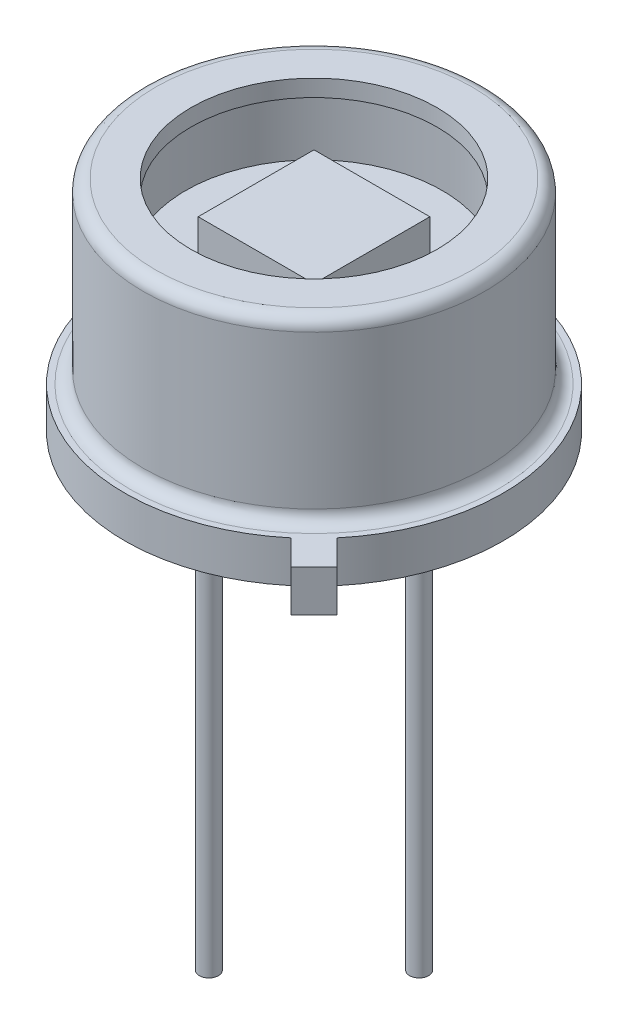
ISO-10303-21;
HEADER;
FILE_DESCRIPTION(('STEP AP214'),'2;1');
FILE_NAME('part.step','',(''),(''),'','','');
FILE_SCHEMA(('AUTOMOTIVE_DESIGN { 1 0 10303 214 1 1 1 1 }'));
ENDSEC;
DATA;
#1=APPLICATION_CONTEXT('core data for automotive mechanical design processes');
#2=APPLICATION_PROTOCOL_DEFINITION('international standard','automotive_design',2000,#1);
#3=PRODUCT_CONTEXT('',#1,'mechanical');
#4=PRODUCT('Part','Part','',(#3));
#5=PRODUCT_RELATED_PRODUCT_CATEGORY('part','',(#4));
#6=PRODUCT_DEFINITION_FORMATION('','',#4);
#7=PRODUCT_DEFINITION_CONTEXT('part definition',#1,'design');
#8=PRODUCT_DEFINITION('design','',#6,#7);
#9=PRODUCT_DEFINITION_SHAPE('','',#8);
#10=(LENGTH_UNIT() NAMED_UNIT(*) SI_UNIT(.MILLI.,.METRE.));
#11=(NAMED_UNIT(*) PLANE_ANGLE_UNIT() SI_UNIT($,.RADIAN.));
#12=(NAMED_UNIT(*) SI_UNIT($,.STERADIAN.) SOLID_ANGLE_UNIT());
#13=UNCERTAINTY_MEASURE_WITH_UNIT(LENGTH_MEASURE(1.E-05),#10,'distance_accuracy_value','');
#14=(GEOMETRIC_REPRESENTATION_CONTEXT(3) GLOBAL_UNCERTAINTY_ASSIGNED_CONTEXT((#13)) GLOBAL_UNIT_ASSIGNED_CONTEXT((#10,
#11,#12)) REPRESENTATION_CONTEXT('',''));
#15=CARTESIAN_POINT('',(0.,0.,0.));
#16=DIRECTION('',(0.,0.,1.));
#17=DIRECTION('',(1.,0.,0.));
#18=AXIS2_PLACEMENT_3D('',#15,#16,#17);
#19=CARTESIAN_POINT('',(0.,-1.,0.));
#20=DIRECTION('',(0.,1.,0.));
#21=DIRECTION('',(0.,0.,1.));
#22=AXIS2_PLACEMENT_3D('',#19,#20,#21);
#23=CYLINDRICAL_SURFACE('',#22,4.572);
#24=CARTESIAN_POINT('',(0.,0.,0.));
#25=DIRECTION('',(0.,1.,0.));
#26=DIRECTION('',(0.,0.,1.));
#27=AXIS2_PLACEMENT_3D('',#24,#25,#26);
#28=CIRCLE('',#27,4.572);
#29=CARTESIAN_POINT('',(3.49927169347665,0.,2.94249581397035));
#30=VERTEX_POINT('',#29);
#31=CARTESIAN_POINT('',(2.94249581397037,0.,3.49927169347664));
#32=VERTEX_POINT('',#31);
#33=EDGE_CURVE('E180',#30,#32,#28,.T.);
#34=ORIENTED_EDGE('',*,*,#33,.F.);
#35=DIRECTION('',(0.,1.,0.));
#36=VECTOR('',#35,1.);
#37=CARTESIAN_POINT('',(3.49927169347665,-0.999999999999999,2.94249581397035));
#38=LINE('',#37,#36);
#39=CARTESIAN_POINT('',(3.49927169347665,-0.999999999999999,2.94249581397035));
#40=VERTEX_POINT('',#39);
#41=EDGE_CURVE('E205',#40,#30,#38,.T.);
#42=ORIENTED_EDGE('',*,*,#41,.F.);
#43=CARTESIAN_POINT('',(0.,-1.,0.));
#44=DIRECTION('',(0.,1.,0.));
#45=DIRECTION('',(0.,0.,1.));
#46=AXIS2_PLACEMENT_3D('',#43,#44,#45);
#47=CIRCLE('',#46,4.572);
#48=CARTESIAN_POINT('',(2.94249581397037,-0.999999999999999,3.49927169347664));
#49=VERTEX_POINT('',#48);
#50=EDGE_CURVE('E181',#40,#49,#47,.T.);
#51=ORIENTED_EDGE('',*,*,#50,.T.);
#52=DIRECTION('',(0.,1.,0.));
#53=VECTOR('',#52,1.);
#54=CARTESIAN_POINT('',(2.94249581397037,-0.999999999999999,3.49927169347664));
#55=LINE('',#54,#53);
#56=EDGE_CURVE('E194',#49,#32,#55,.T.);
#57=ORIENTED_EDGE('',*,*,#56,.T.);
#58=EDGE_LOOP('',(#34,#42,#51,#57));
#59=FACE_BOUND('',#58,.T.);
#60=ADVANCED_FACE('F36',(#59),#23,.T.);
#61=CARTESIAN_POINT('',(4.10992910970935,-0.999999999999999,3.55315323020305));
#62=DIRECTION('',(0.707106781186545,0.,-0.70710678118655));
#63=DIRECTION('',(-0.70710678118655,0.,-0.707106781186545));
#64=AXIS2_PLACEMENT_3D('',#61,#62,#63);
#65=PLANE('',#64);
#66=DIRECTION('',(-0.70710678118655,0.,-0.707106781186545));
#67=VECTOR('',#66,1.);
#68=CARTESIAN_POINT('',(4.10992910970935,0.,3.55315323020305));
#69=LINE('',#68,#67);
#70=CARTESIAN_POINT('',(4.10992910970935,0.,3.55315323020305));
#71=VERTEX_POINT('',#70);
#72=EDGE_CURVE('E185',#71,#30,#69,.T.);
#73=ORIENTED_EDGE('',*,*,#72,.F.);
#74=DIRECTION('',(0.,1.,0.));
#75=VECTOR('',#74,1.);
#76=CARTESIAN_POINT('',(4.10992910970935,-0.999999999999999,3.55315323020305));
#77=LINE('',#76,#75);
#78=CARTESIAN_POINT('',(4.10992910970935,-0.999999999999999,3.55315323020305));
#79=VERTEX_POINT('',#78);
#80=EDGE_CURVE('E208',#79,#71,#77,.T.);
#81=ORIENTED_EDGE('',*,*,#80,.F.);
#82=DIRECTION('',(-0.70710678118655,0.,-0.707106781186545));
#83=VECTOR('',#82,1.);
#84=CARTESIAN_POINT('',(4.10992910970935,-0.999999999999999,3.55315323020305));
#85=LINE('',#84,#83);
#86=EDGE_CURVE('E191',#79,#40,#85,.T.);
#87=ORIENTED_EDGE('',*,*,#86,.T.);
#88=ORIENTED_EDGE('',*,*,#41,.T.);
#89=EDGE_LOOP('',(#73,#81,#87,#88));
#90=FACE_BOUND('',#89,.T.);
#91=ADVANCED_FACE('F277',(#90),#65,.T.);
#92=CARTESIAN_POINT('',(3.55315323020307,-0.999999999999999,4.10992910970934));
#93=DIRECTION('',(0.70710678118655,0.,0.707106781186545));
#94=DIRECTION('',(0.707106781186545,0.,-0.70710678118655));
#95=AXIS2_PLACEMENT_3D('',#92,#93,#94);
#96=PLANE('',#95);
#97=DIRECTION('',(0.707106781186545,0.,-0.70710678118655));
#98=VECTOR('',#97,1.);
#99=CARTESIAN_POINT('',(3.55315323020307,0.,4.10992910970934));
#100=LINE('',#99,#98);
#101=CARTESIAN_POINT('',(3.55315323020307,0.,4.10992910970934));
#102=VERTEX_POINT('',#101);
#103=EDGE_CURVE('E200',#102,#71,#100,.T.);
#104=ORIENTED_EDGE('',*,*,#103,.F.);
#105=DIRECTION('',(0.,1.,0.));
#106=VECTOR('',#105,1.);
#107=CARTESIAN_POINT('',(3.55315323020307,-0.999999999999999,4.10992910970934));
#108=LINE('',#107,#106);
#109=CARTESIAN_POINT('',(3.55315323020307,-0.999999999999999,4.10992910970934));
#110=VERTEX_POINT('',#109);
#111=EDGE_CURVE('E210',#110,#102,#108,.T.);
#112=ORIENTED_EDGE('',*,*,#111,.F.);
#113=DIRECTION('',(0.707106781186545,0.,-0.70710678118655));
#114=VECTOR('',#113,1.);
#115=CARTESIAN_POINT('',(3.55315323020307,-0.999999999999999,4.10992910970934));
#116=LINE('',#115,#114);
#117=EDGE_CURVE('E188',#110,#79,#116,.T.);
#118=ORIENTED_EDGE('',*,*,#117,.T.);
#119=ORIENTED_EDGE('',*,*,#80,.T.);
#120=EDGE_LOOP('',(#104,#112,#118,#119));
#121=FACE_BOUND('',#120,.T.);
#122=ADVANCED_FACE('F283',(#121),#96,.T.);
#123=CARTESIAN_POINT('',(2.94249581397037,-0.999999999999999,3.49927169347664));
#124=DIRECTION('',(-0.707106781186546,0.,0.707106781186549));
#125=DIRECTION('',(0.707106781186549,0.,0.707106781186546));
#126=AXIS2_PLACEMENT_3D('',#123,#124,#125);
#127=PLANE('',#126);
#128=DIRECTION('',(0.707106781186549,0.,0.707106781186546));
#129=VECTOR('',#128,1.);
#130=CARTESIAN_POINT('',(2.94249581397037,0.,3.49927169347664));
#131=LINE('',#130,#129);
#132=EDGE_CURVE('E197',#32,#102,#131,.T.);
#133=ORIENTED_EDGE('',*,*,#132,.F.);
#134=ORIENTED_EDGE('',*,*,#56,.F.);
#135=DIRECTION('',(0.707106781186549,0.,0.707106781186546));
#136=VECTOR('',#135,1.);
#137=CARTESIAN_POINT('',(2.94249581397037,-0.999999999999999,3.49927169347664));
#138=LINE('',#137,#136);
#139=EDGE_CURVE('E184',#49,#110,#138,.T.);
#140=ORIENTED_EDGE('',*,*,#139,.T.);
#141=ORIENTED_EDGE('',*,*,#111,.T.);
#142=EDGE_LOOP('',(#133,#134,#140,#141));
#143=FACE_BOUND('',#142,.T.);
#144=ADVANCED_FACE('F288',(#143),#127,.T.);
#145=CARTESIAN_POINT('',(0.,-1.,0.));
#146=DIRECTION('',(0.,1.,0.));
#147=DIRECTION('',(0.,0.,1.));
#148=AXIS2_PLACEMENT_3D('',#145,#146,#147);
#149=PLANE('',#148);
#150=CARTESIAN_POINT('',(2.54,-0.999999999999999,0.));
#151=DIRECTION('',(0.,1.,0.));
#152=DIRECTION('',(0.,0.,1.));
#153=AXIS2_PLACEMENT_3D('',#150,#151,#152);
#154=CIRCLE('',#153,0.23);
#155=CARTESIAN_POINT('',(2.54,-0.999999999999999,0.23));
#156=VERTEX_POINT('',#155);
#157=EDGE_CURVE('E136',#156,#156,#154,.T.);
#158=ORIENTED_EDGE('',*,*,#157,.T.);
#159=EDGE_LOOP('',(#158));
#160=FACE_BOUND('',#159,.T.);
#161=CARTESIAN_POINT('',(0.,-0.999999999999999,2.54));
#162=DIRECTION('',(0.,1.,0.));
#163=DIRECTION('',(0.,0.,1.));
#164=AXIS2_PLACEMENT_3D('',#161,#162,#163);
#165=CIRCLE('',#164,0.23);
#166=CARTESIAN_POINT('',(0.,-0.999999999999999,2.77));
#167=VERTEX_POINT('',#166);
#168=EDGE_CURVE('E146',#167,#167,#165,.T.);
#169=ORIENTED_EDGE('',*,*,#168,.T.);
#170=EDGE_LOOP('',(#169));
#171=FACE_BOUND('',#170,.T.);
#172=CARTESIAN_POINT('',(-2.54,-1.,0.));
#173=DIRECTION('',(0.,1.,0.));
#174=DIRECTION('',(0.,0.,1.));
#175=AXIS2_PLACEMENT_3D('',#172,#173,#174);
#176=CIRCLE('',#175,0.23);
#177=CARTESIAN_POINT('',(-2.54,-1.,0.229999999999986));
#178=VERTEX_POINT('',#177);
#179=EDGE_CURVE('E155',#178,#178,#176,.T.);
#180=ORIENTED_EDGE('',*,*,#179,.T.);
#181=EDGE_LOOP('',(#180));
#182=FACE_BOUND('',#181,.T.);
#183=CARTESIAN_POINT('',(0.,-1.,-2.54));
#184=DIRECTION('',(0.,1.,0.));
#185=DIRECTION('',(0.,0.,1.));
#186=AXIS2_PLACEMENT_3D('',#183,#184,#185);
#187=CIRCLE('',#186,0.23);
#188=CARTESIAN_POINT('',(0.,-1.,-2.31));
#189=VERTEX_POINT('',#188);
#190=EDGE_CURVE('E163',#189,#189,#187,.T.);
#191=ORIENTED_EDGE('',*,*,#190,.T.);
#192=EDGE_LOOP('',(#191));
#193=FACE_BOUND('',#192,.T.);
#194=ORIENTED_EDGE('',*,*,#50,.F.);
#195=ORIENTED_EDGE('',*,*,#86,.F.);
#196=ORIENTED_EDGE('',*,*,#117,.F.);
#197=ORIENTED_EDGE('',*,*,#139,.F.);
#198=EDGE_LOOP('',(#194,#195,#196,#197));
#199=FACE_BOUND('',#198,.T.);
#200=ADVANCED_FACE('F306',(#160,#171,#182,#193,#199),#149,.F.);
#201=CARTESIAN_POINT('',(0.,0.,0.));
#202=DIRECTION('',(0.,1.,0.));
#203=DIRECTION('',(0.,0.,1.));
#204=AXIS2_PLACEMENT_3D('',#201,#202,#203);
#205=PLANE('',#204);
#206=CARTESIAN_POINT('',(0.,0.,0.));
#207=DIRECTION('',(0.,1.,0.));
#208=DIRECTION('',(0.,0.,1.));
#209=AXIS2_PLACEMENT_3D('',#206,#207,#208);
#210=CIRCLE('',#209,4.4275);
#211=CARTESIAN_POINT('',(0.,0.,4.4275));
#212=VERTEX_POINT('',#211);
#213=EDGE_CURVE('E218',#212,#212,#210,.F.);
#214=ORIENTED_EDGE('',*,*,#213,.T.);
#215=EDGE_LOOP('',(#214));
#216=FACE_BOUND('',#215,.T.);
#217=ORIENTED_EDGE('',*,*,#33,.T.);
#218=ORIENTED_EDGE('',*,*,#132,.T.);
#219=ORIENTED_EDGE('',*,*,#103,.T.);
#220=ORIENTED_EDGE('',*,*,#72,.T.);
#221=EDGE_LOOP('',(#217,#218,#219,#220));
#222=FACE_BOUND('',#221,.T.);
#223=ADVANCED_FACE('F273',(#216,#222),#205,.T.);
#224=CARTESIAN_POINT('',(0.,0.8936,0.));
#225=DIRECTION('',(0.,-1.,0.));
#226=DIRECTION('',(1.,0.,0.));
#227=AXIS2_PLACEMENT_3D('',#224,#225,#226);
#228=CYLINDRICAL_SURFACE('',#227,4.1275);
#229=CARTESIAN_POINT('',(0.,0.3,0.));
#230=DIRECTION('',(0.,1.,0.));
#231=DIRECTION('',(0.,0.,1.));
#232=AXIS2_PLACEMENT_3D('',#229,#230,#231);
#233=CIRCLE('',#232,4.1275);
#234=CARTESIAN_POINT('',(0.,0.3,4.1275));
#235=VERTEX_POINT('',#234);
#236=EDGE_CURVE('E215',#235,#235,#233,.T.);
#237=ORIENTED_EDGE('',*,*,#236,.T.);
#238=EDGE_LOOP('',(#237));
#239=FACE_BOUND('',#238,.T.);
#240=CARTESIAN_POINT('',(0.,4.,0.));
#241=DIRECTION('',(0.,1.,0.));
#242=DIRECTION('',(-1.,0.,0.));
#243=AXIS2_PLACEMENT_3D('',#240,#241,#242);
#244=CIRCLE('',#243,4.1275);
#245=CARTESIAN_POINT('',(-4.1275,4.,0.));
#246=VERTEX_POINT('',#245);
#247=EDGE_CURVE('E207',#246,#246,#244,.F.);
#248=ORIENTED_EDGE('',*,*,#247,.T.);
#249=EDGE_LOOP('',(#248));
#250=FACE_BOUND('',#249,.T.);
#251=ADVANCED_FACE('F267',(#239,#250),#228,.T.);
#252=CARTESIAN_POINT('',(4.1275,4.3,0.));
#253=DIRECTION('',(0.,1.,0.));
#254=DIRECTION('',(-1.,0.,0.));
#255=AXIS2_PLACEMENT_3D('',#252,#253,#254);
#256=PLANE('',#255);
#257=CARTESIAN_POINT('',(0.,4.3,0.));
#258=DIRECTION('',(0.,1.,0.));
#259=DIRECTION('',(-1.,0.,0.));
#260=AXIS2_PLACEMENT_3D('',#257,#258,#259);
#261=CIRCLE('',#260,3.8275);
#262=CARTESIAN_POINT('',(-3.8275,4.3,0.));
#263=VERTEX_POINT('',#262);
#264=EDGE_CURVE('E221',#263,#263,#261,.T.);
#265=ORIENTED_EDGE('',*,*,#264,.T.);
#266=EDGE_LOOP('',(#265));
#267=FACE_BOUND('',#266,.T.);
#268=CARTESIAN_POINT('',(0.,4.3,0.));
#269=DIRECTION('',(0.,-1.,0.));
#270=DIRECTION('',(1.,0.,0.));
#271=AXIS2_PLACEMENT_3D('',#268,#269,#270);
#272=CIRCLE('',#271,2.9718);
#273=CARTESIAN_POINT('',(2.9718,4.3,0.));
#274=VERTEX_POINT('',#273);
#275=EDGE_CURVE('E177',#274,#274,#272,.T.);
#276=ORIENTED_EDGE('',*,*,#275,.T.);
#277=EDGE_LOOP('',(#276));
#278=FACE_BOUND('',#277,.T.);
#279=ADVANCED_FACE('F262',(#267,#278),#256,.T.);
#280=CARTESIAN_POINT('',(0.,0.8936,0.));
#281=DIRECTION('',(0.,-1.,0.));
#282=DIRECTION('',(1.,0.,0.));
#283=AXIS2_PLACEMENT_3D('',#280,#281,#282);
#284=CYLINDRICAL_SURFACE('',#283,2.9718);
#285=CARTESIAN_POINT('',(0.,3.8936,0.));
#286=DIRECTION('',(0.,-1.,0.));
#287=DIRECTION('',(1.,0.,0.));
#288=AXIS2_PLACEMENT_3D('',#285,#286,#287);
#289=CIRCLE('',#288,2.9718);
#290=CARTESIAN_POINT('',(2.9718,3.8936,0.));
#291=VERTEX_POINT('',#290);
#292=EDGE_CURVE('E174',#291,#291,#289,.T.);
#293=ORIENTED_EDGE('',*,*,#292,.T.);
#294=EDGE_LOOP('',(#293));
#295=FACE_BOUND('',#294,.T.);
#296=ORIENTED_EDGE('',*,*,#275,.F.);
#297=EDGE_LOOP('',(#296));
#298=FACE_BOUND('',#297,.T.);
#299=ADVANCED_FACE('F256',(#295,#298),#284,.F.);
#300=CARTESIAN_POINT('',(2.9718,3.8936,0.));
#301=DIRECTION('',(0.,-1.,0.));
#302=DIRECTION('',(1.,0.,0.));
#303=AXIS2_PLACEMENT_3D('',#300,#301,#302);
#304=PLANE('',#303);
#305=CARTESIAN_POINT('',(0.,3.8936,0.));
#306=DIRECTION('',(0.,-1.,0.));
#307=DIRECTION('',(1.,0.,0.));
#308=AXIS2_PLACEMENT_3D('',#305,#306,#307);
#309=CIRCLE('',#308,3.7211);
#310=CARTESIAN_POINT('',(3.7211,3.8936,0.));
#311=VERTEX_POINT('',#310);
#312=EDGE_CURVE('E171',#311,#311,#309,.T.);
#313=ORIENTED_EDGE('',*,*,#312,.T.);
#314=EDGE_LOOP('',(#313));
#315=FACE_BOUND('',#314,.T.);
#316=ORIENTED_EDGE('',*,*,#292,.F.);
#317=EDGE_LOOP('',(#316));
#318=FACE_BOUND('',#317,.T.);
#319=ADVANCED_FACE('F250',(#315,#318),#304,.T.);
#320=CARTESIAN_POINT('',(0.,0.8936,0.));
#321=DIRECTION('',(0.,-1.,0.));
#322=DIRECTION('',(1.,0.,0.));
#323=AXIS2_PLACEMENT_3D('',#320,#321,#322);
#324=CYLINDRICAL_SURFACE('',#323,3.7211);
#325=CARTESIAN_POINT('',(0.,0.893600000000001,0.));
#326=DIRECTION('',(0.,-1.,0.));
#327=DIRECTION('',(1.,0.,0.));
#328=AXIS2_PLACEMENT_3D('',#325,#326,#327);
#329=CIRCLE('',#328,3.7211);
#330=CARTESIAN_POINT('',(3.7211,0.893600000000001,0.));
#331=VERTEX_POINT('',#330);
#332=EDGE_CURVE('E168',#331,#331,#329,.T.);
#333=ORIENTED_EDGE('',*,*,#332,.T.);
#334=EDGE_LOOP('',(#333));
#335=FACE_BOUND('',#334,.T.);
#336=ORIENTED_EDGE('',*,*,#312,.F.);
#337=EDGE_LOOP('',(#336));
#338=FACE_BOUND('',#337,.T.);
#339=ADVANCED_FACE('F239',(#335,#338),#324,.F.);
#340=CARTESIAN_POINT('',(3.7211,0.8936,0.));
#341=DIRECTION('',(0.,1.,0.));
#342=DIRECTION('',(-1.,0.,0.));
#343=AXIS2_PLACEMENT_3D('',#340,#341,#342);
#344=PLANE('',#343);
#345=CARTESIAN_POINT('',(2.54,0.8936,0.));
#346=DIRECTION('',(0.,1.,0.));
#347=DIRECTION('',(-1.,0.,0.));
#348=AXIS2_PLACEMENT_3D('',#345,#346,#347);
#349=CIRCLE('',#348,0.23);
#350=CARTESIAN_POINT('',(2.31,0.8936,0.));
#351=VERTEX_POINT('',#350);
#352=EDGE_CURVE('E11',#351,#351,#349,.T.);
#353=ORIENTED_EDGE('',*,*,#352,.F.);
#354=EDGE_LOOP('',(#353));
#355=FACE_BOUND('',#354,.T.);
#356=CARTESIAN_POINT('',(0.,0.8936,2.54));
#357=DIRECTION('',(0.,1.,0.));
#358=DIRECTION('',(-1.,0.,0.));
#359=AXIS2_PLACEMENT_3D('',#356,#357,#358);
#360=CIRCLE('',#359,0.23);
#361=CARTESIAN_POINT('',(-0.230000000000011,0.8936,2.54));
#362=VERTEX_POINT('',#361);
#363=EDGE_CURVE('E44',#362,#362,#360,.T.);
#364=ORIENTED_EDGE('',*,*,#363,.F.);
#365=EDGE_LOOP('',(#364));
#366=FACE_BOUND('',#365,.T.);
#367=CARTESIAN_POINT('',(-2.54,0.8936,0.));
#368=DIRECTION('',(0.,1.,0.));
#369=DIRECTION('',(-1.,0.,0.));
#370=AXIS2_PLACEMENT_3D('',#367,#368,#369);
#371=CIRCLE('',#370,0.23);
#372=CARTESIAN_POINT('',(-2.77,0.8936,0.));
#373=VERTEX_POINT('',#372);
#374=EDGE_CURVE('E227',#373,#373,#371,.T.);
#375=ORIENTED_EDGE('',*,*,#374,.F.);
#376=EDGE_LOOP('',(#375));
#377=FACE_BOUND('',#376,.T.);
#378=CARTESIAN_POINT('',(0.,0.8936,-2.54));
#379=DIRECTION('',(0.,1.,0.));
#380=DIRECTION('',(-1.,0.,0.));
#381=AXIS2_PLACEMENT_3D('',#378,#379,#380);
#382=CIRCLE('',#381,0.23);
#383=CARTESIAN_POINT('',(-0.229999999999969,0.8936,-2.54));
#384=VERTEX_POINT('',#383);
#385=EDGE_CURVE('E224',#384,#384,#382,.T.);
#386=ORIENTED_EDGE('',*,*,#385,.F.);
#387=EDGE_LOOP('',(#386));
#388=FACE_BOUND('',#387,.T.);
#389=ORIENTED_EDGE('',*,*,#332,.F.);
#390=EDGE_LOOP('',(#389));
#391=FACE_BOUND('',#390,.T.);
#392=ADVANCED_FACE('F235',(#355,#366,#377,#388,#391),#344,.T.);
#393=CARTESIAN_POINT('',(0.,0.3,0.));
#394=DIRECTION('',(0.,1.,0.));
#395=DIRECTION('',(0.,0.,1.));
#396=AXIS2_PLACEMENT_3D('',#393,#394,#395);
#397=TOROIDAL_SURFACE('',#396,4.4275,0.3);
#398=ORIENTED_EDGE('',*,*,#213,.F.);
#399=EDGE_LOOP('',(#398));
#400=FACE_BOUND('',#399,.T.);
#401=ORIENTED_EDGE('',*,*,#236,.F.);
#402=EDGE_LOOP('',(#401));
#403=FACE_BOUND('',#402,.T.);
#404=ADVANCED_FACE('F238',(#400,#403),#397,.F.);
#405=CARTESIAN_POINT('',(0.,4.,0.));
#406=DIRECTION('',(0.,1.,0.));
#407=DIRECTION('',(-1.,0.,0.));
#408=AXIS2_PLACEMENT_3D('',#405,#406,#407);
#409=TOROIDAL_SURFACE('',#408,3.8275,0.3);
#410=ORIENTED_EDGE('',*,*,#264,.F.);
#411=EDGE_LOOP('',(#410));
#412=FACE_BOUND('',#411,.T.);
#413=ORIENTED_EDGE('',*,*,#247,.F.);
#414=EDGE_LOOP('',(#413));
#415=FACE_BOUND('',#414,.T.);
#416=ADVANCED_FACE('F38',(#412,#415),#409,.T.);
#417=CARTESIAN_POINT('',(0.,1.3,-2.54));
#418=DIRECTION('',(0.,-1.,0.));
#419=DIRECTION('',(0.,0.,-1.));
#420=AXIS2_PLACEMENT_3D('',#417,#418,#419);
#421=CYLINDRICAL_SURFACE('',#420,0.23);
#422=ORIENTED_EDGE('',*,*,#385,.T.);
#423=EDGE_LOOP('',(#422));
#424=FACE_BOUND('',#423,.T.);
#425=CARTESIAN_POINT('',(0.,1.3,-2.54));
#426=DIRECTION('',(0.,-1.,0.));
#427=DIRECTION('',(0.,0.,-1.));
#428=AXIS2_PLACEMENT_3D('',#425,#426,#427);
#429=CIRCLE('',#428,0.23);
#430=CARTESIAN_POINT('',(0.,1.3,-2.77));
#431=VERTEX_POINT('',#430);
#432=EDGE_CURVE('E137',#431,#431,#429,.T.);
#433=ORIENTED_EDGE('',*,*,#432,.T.);
#434=EDGE_LOOP('',(#433));
#435=FACE_BOUND('',#434,.T.);
#436=ADVANCED_FACE('F295',(#424,#435),#421,.T.);
#437=CARTESIAN_POINT('',(0.,-11.,-2.54));
#438=DIRECTION('',(0.,-1.,0.));
#439=DIRECTION('',(0.,0.,-1.));
#440=AXIS2_PLACEMENT_3D('',#437,#438,#439);
#441=CIRCLE('',#440,0.23);
#442=CARTESIAN_POINT('',(0.,-11.,-2.77));
#443=VERTEX_POINT('',#442);
#444=EDGE_CURVE('E160',#443,#443,#441,.T.);
#445=ORIENTED_EDGE('',*,*,#444,.F.);
#446=EDGE_LOOP('',(#445));
#447=FACE_BOUND('',#446,.T.);
#448=ORIENTED_EDGE('',*,*,#190,.F.);
#449=EDGE_LOOP('',(#448));
#450=FACE_BOUND('',#449,.T.);
#451=ADVANCED_FACE('F397',(#447,#450),#421,.T.);
#452=CARTESIAN_POINT('',(0.,-11.,-2.54));
#453=DIRECTION('',(0.,-1.,0.));
#454=DIRECTION('',(0.,0.,-1.));
#455=AXIS2_PLACEMENT_3D('',#452,#453,#454);
#456=PLANE('',#455);
#457=ORIENTED_EDGE('',*,*,#444,.T.);
#458=EDGE_LOOP('',(#457));
#459=FACE_BOUND('',#458,.T.);
#460=ADVANCED_FACE('F407',(#459),#456,.T.);
#461=CARTESIAN_POINT('',(-2.54,1.3,0.));
#462=DIRECTION('',(0.,-1.,0.));
#463=DIRECTION('',(0.,0.,-1.));
#464=AXIS2_PLACEMENT_3D('',#461,#462,#463);
#465=CYLINDRICAL_SURFACE('',#464,0.23);
#466=ORIENTED_EDGE('',*,*,#374,.T.);
#467=EDGE_LOOP('',(#466));
#468=FACE_BOUND('',#467,.T.);
#469=CARTESIAN_POINT('',(-2.54,1.3,0.));
#470=DIRECTION('',(0.,-1.,0.));
#471=DIRECTION('',(0.,0.,-1.));
#472=AXIS2_PLACEMENT_3D('',#469,#470,#471);
#473=CIRCLE('',#472,0.23);
#474=CARTESIAN_POINT('',(-2.54,1.3,-0.230000000000014));
#475=VERTEX_POINT('',#474);
#476=EDGE_CURVE('E149',#475,#475,#473,.T.);
#477=ORIENTED_EDGE('',*,*,#476,.T.);
#478=EDGE_LOOP('',(#477));
#479=FACE_BOUND('',#478,.T.);
#480=ADVANCED_FACE('F416',(#468,#479),#465,.T.);
#481=CARTESIAN_POINT('',(-2.54,-11.,0.));
#482=DIRECTION('',(0.,-1.,0.));
#483=DIRECTION('',(0.,0.,-1.));
#484=AXIS2_PLACEMENT_3D('',#481,#482,#483);
#485=CIRCLE('',#484,0.23);
#486=CARTESIAN_POINT('',(-2.54,-11.,-0.230000000000021));
#487=VERTEX_POINT('',#486);
#488=EDGE_CURVE('E152',#487,#487,#485,.T.);
#489=ORIENTED_EDGE('',*,*,#488,.F.);
#490=EDGE_LOOP('',(#489));
#491=FACE_BOUND('',#490,.T.);
#492=ORIENTED_EDGE('',*,*,#179,.F.);
#493=EDGE_LOOP('',(#492));
#494=FACE_BOUND('',#493,.T.);
#495=ADVANCED_FACE('F426',(#491,#494),#465,.T.);
#496=CARTESIAN_POINT('',(-2.54,-11.,0.));
#497=DIRECTION('',(0.,-1.,0.));
#498=DIRECTION('',(0.,0.,-1.));
#499=AXIS2_PLACEMENT_3D('',#496,#497,#498);
#500=PLANE('',#499);
#501=ORIENTED_EDGE('',*,*,#488,.T.);
#502=EDGE_LOOP('',(#501));
#503=FACE_BOUND('',#502,.T.);
#504=ADVANCED_FACE('F436',(#503),#500,.T.);
#505=CARTESIAN_POINT('',(0.,1.3,2.54));
#506=DIRECTION('',(0.,-1.,0.));
#507=DIRECTION('',(0.,0.,-1.));
#508=AXIS2_PLACEMENT_3D('',#505,#506,#507);
#509=CYLINDRICAL_SURFACE('',#508,0.23);
#510=ORIENTED_EDGE('',*,*,#363,.T.);
#511=EDGE_LOOP('',(#510));
#512=FACE_BOUND('',#511,.T.);
#513=CARTESIAN_POINT('',(0.,1.3,2.54));
#514=DIRECTION('',(0.,-1.,0.));
#515=DIRECTION('',(0.,0.,-1.));
#516=AXIS2_PLACEMENT_3D('',#513,#514,#515);
#517=CIRCLE('',#516,0.23);
#518=CARTESIAN_POINT('',(0.,1.3,2.31));
#519=VERTEX_POINT('',#518);
#520=EDGE_CURVE('E140',#519,#519,#517,.T.);
#521=ORIENTED_EDGE('',*,*,#520,.T.);
#522=EDGE_LOOP('',(#521));
#523=FACE_BOUND('',#522,.T.);
#524=ADVANCED_FACE('F232',(#512,#523),#509,.T.);
#525=CARTESIAN_POINT('',(0.,-11.,2.54));
#526=DIRECTION('',(0.,-1.,0.));
#527=DIRECTION('',(0.,0.,-1.));
#528=AXIS2_PLACEMENT_3D('',#525,#526,#527);
#529=CIRCLE('',#528,0.23);
#530=CARTESIAN_POINT('',(0.,-11.,2.31));
#531=VERTEX_POINT('',#530);
#532=EDGE_CURVE('E143',#531,#531,#529,.T.);
#533=ORIENTED_EDGE('',*,*,#532,.F.);
#534=EDGE_LOOP('',(#533));
#535=FACE_BOUND('',#534,.T.);
#536=ORIENTED_EDGE('',*,*,#168,.F.);
#537=EDGE_LOOP('',(#536));
#538=FACE_BOUND('',#537,.T.);
#539=ADVANCED_FACE('F454',(#535,#538),#509,.T.);
#540=CARTESIAN_POINT('',(0.,-11.,2.54));
#541=DIRECTION('',(0.,-1.,0.));
#542=DIRECTION('',(0.,0.,-1.));
#543=AXIS2_PLACEMENT_3D('',#540,#541,#542);
#544=PLANE('',#543);
#545=ORIENTED_EDGE('',*,*,#532,.T.);
#546=EDGE_LOOP('',(#545));
#547=FACE_BOUND('',#546,.T.);
#548=ADVANCED_FACE('F463',(#547),#544,.T.);
#549=CARTESIAN_POINT('',(2.54,1.3,0.));
#550=DIRECTION('',(0.,-1.,0.));
#551=DIRECTION('',(0.,0.,-1.));
#552=AXIS2_PLACEMENT_3D('',#549,#550,#551);
#553=CYLINDRICAL_SURFACE('',#552,0.23);
#554=ORIENTED_EDGE('',*,*,#352,.T.);
#555=EDGE_LOOP('',(#554));
#556=FACE_BOUND('',#555,.T.);
#557=CARTESIAN_POINT('',(2.54,1.3,0.));
#558=DIRECTION('',(0.,-1.,0.));
#559=DIRECTION('',(0.,0.,-1.));
#560=AXIS2_PLACEMENT_3D('',#557,#558,#559);
#561=CIRCLE('',#560,0.23);
#562=CARTESIAN_POINT('',(2.54,1.3,-0.23));
#563=VERTEX_POINT('',#562);
#564=EDGE_CURVE('E131',#563,#563,#561,.T.);
#565=ORIENTED_EDGE('',*,*,#564,.T.);
#566=EDGE_LOOP('',(#565));
#567=FACE_BOUND('',#566,.T.);
#568=ADVANCED_FACE('F472',(#556,#567),#553,.T.);
#569=CARTESIAN_POINT('',(2.54,-11.,0.));
#570=DIRECTION('',(0.,-1.,0.));
#571=DIRECTION('',(0.,0.,-1.));
#572=AXIS2_PLACEMENT_3D('',#569,#570,#571);
#573=CIRCLE('',#572,0.23);
#574=CARTESIAN_POINT('',(2.54,-11.,-0.23));
#575=VERTEX_POINT('',#574);
#576=EDGE_CURVE('E133',#575,#575,#573,.T.);
#577=ORIENTED_EDGE('',*,*,#576,.F.);
#578=EDGE_LOOP('',(#577));
#579=FACE_BOUND('',#578,.T.);
#580=ORIENTED_EDGE('',*,*,#157,.F.);
#581=EDGE_LOOP('',(#580));
#582=FACE_BOUND('',#581,.T.);
#583=ADVANCED_FACE('F482',(#579,#582),#553,.T.);
#584=CARTESIAN_POINT('',(2.54,-11.,0.));
#585=DIRECTION('',(0.,-1.,0.));
#586=DIRECTION('',(0.,0.,-1.));
#587=AXIS2_PLACEMENT_3D('',#584,#585,#586);
#588=PLANE('',#587);
#589=ORIENTED_EDGE('',*,*,#576,.T.);
#590=EDGE_LOOP('',(#589));
#591=FACE_BOUND('',#590,.T.);
#592=ADVANCED_FACE('F492',(#591),#588,.T.);
#593=CARTESIAN_POINT('',(0.,2.5,0.));
#594=DIRECTION('',(0.,-1.,0.));
#595=DIRECTION('',(0.,0.,-1.));
#596=AXIS2_PLACEMENT_3D('',#593,#594,#595);
#597=CYLINDRICAL_SURFACE('',#596,3.1);
#598=CARTESIAN_POINT('',(0.,2.5,0.));
#599=DIRECTION('',(0.,1.,0.));
#600=DIRECTION('',(0.,0.,1.));
#601=AXIS2_PLACEMENT_3D('',#598,#599,#600);
#602=CIRCLE('',#601,3.1);
#603=CARTESIAN_POINT('',(0.,2.5,3.1));
#604=VERTEX_POINT('',#603);
#605=EDGE_CURVE('E124',#604,#604,#602,.T.);
#606=ORIENTED_EDGE('',*,*,#605,.F.);
#607=EDGE_LOOP('',(#606));
#608=FACE_BOUND('',#607,.T.);
#609=CARTESIAN_POINT('',(0.,1.3,0.));
#610=DIRECTION('',(0.,1.,0.));
#611=DIRECTION('',(0.,0.,1.));
#612=AXIS2_PLACEMENT_3D('',#609,#610,#611);
#613=CIRCLE('',#612,3.1);
#614=CARTESIAN_POINT('',(0.,1.3,3.1));
#615=VERTEX_POINT('',#614);
#616=EDGE_CURVE('E121',#615,#615,#613,.T.);
#617=ORIENTED_EDGE('',*,*,#616,.T.);
#618=EDGE_LOOP('',(#617));
#619=FACE_BOUND('',#618,.T.);
#620=ADVANCED_FACE('F501',(#608,#619),#597,.T.);
#621=CARTESIAN_POINT('',(0.,2.5,0.));
#622=DIRECTION('',(0.,1.,0.));
#623=DIRECTION('',(0.,0.,1.));
#624=AXIS2_PLACEMENT_3D('',#621,#622,#623);
#625=PLANE('',#624);
#626=DIRECTION('',(0.,0.,1.));
#627=VECTOR('',#626,1.);
#628=CARTESIAN_POINT('',(-1.4,2.5,-1.4));
#629=LINE('',#628,#627);
#630=CARTESIAN_POINT('',(-1.4,2.5,-1.4));
#631=VERTEX_POINT('',#630);
#632=CARTESIAN_POINT('',(-1.4,2.5,1.4));
#633=VERTEX_POINT('',#632);
#634=EDGE_CURVE('E51',#631,#633,#629,.T.);
#635=ORIENTED_EDGE('',*,*,#634,.F.);
#636=DIRECTION('',(-1.,0.,0.));
#637=VECTOR('',#636,1.);
#638=CARTESIAN_POINT('',(-1.4,2.5,-1.4));
#639=LINE('',#638,#637);
#640=CARTESIAN_POINT('',(1.4,2.5,-1.4));
#641=VERTEX_POINT('',#640);
#642=EDGE_CURVE('E55',#641,#631,#639,.T.);
#643=ORIENTED_EDGE('',*,*,#642,.F.);
#644=DIRECTION('',(0.,0.,-1.));
#645=VECTOR('',#644,1.);
#646=CARTESIAN_POINT('',(1.4,2.5,-1.4));
#647=LINE('',#646,#645);
#648=CARTESIAN_POINT('',(1.40000000000001,2.5,1.4));
#649=VERTEX_POINT('',#648);
#650=EDGE_CURVE('E581',#649,#641,#647,.T.);
#651=ORIENTED_EDGE('',*,*,#650,.F.);
#652=DIRECTION('',(1.,0.,0.));
#653=VECTOR('',#652,1.);
#654=CARTESIAN_POINT('',(-1.4,2.5,1.4));
#655=LINE('',#654,#653);
#656=EDGE_CURVE('E587',#633,#649,#655,.T.);
#657=ORIENTED_EDGE('',*,*,#656,.F.);
#658=EDGE_LOOP('',(#635,#643,#651,#657));
#659=FACE_BOUND('',#658,.T.);
#660=ORIENTED_EDGE('',*,*,#605,.T.);
#661=EDGE_LOOP('',(#660));
#662=FACE_BOUND('',#661,.T.);
#663=ADVANCED_FACE('F511',(#659,#662),#625,.T.);
#664=CARTESIAN_POINT('',(0.,1.3,0.));
#665=DIRECTION('',(0.,1.,0.));
#666=DIRECTION('',(0.,0.,1.));
#667=AXIS2_PLACEMENT_3D('',#664,#665,#666);
#668=PLANE('',#667);
#669=ORIENTED_EDGE('',*,*,#432,.F.);
#670=EDGE_LOOP('',(#669));
#671=FACE_BOUND('',#670,.T.);
#672=ORIENTED_EDGE('',*,*,#476,.F.);
#673=EDGE_LOOP('',(#672));
#674=FACE_BOUND('',#673,.T.);
#675=ORIENTED_EDGE('',*,*,#520,.F.);
#676=EDGE_LOOP('',(#675));
#677=FACE_BOUND('',#676,.T.);
#678=ORIENTED_EDGE('',*,*,#564,.F.);
#679=EDGE_LOOP('',(#678));
#680=FACE_BOUND('',#679,.T.);
#681=ORIENTED_EDGE('',*,*,#616,.F.);
#682=EDGE_LOOP('',(#681));
#683=FACE_BOUND('',#682,.T.);
#684=ADVANCED_FACE('F521',(#671,#674,#677,#680,#683),#668,.F.);
#685=CARTESIAN_POINT('',(-1.4,3.5,-1.4));
#686=DIRECTION('',(1.,0.,0.));
#687=DIRECTION('',(0.,0.,-1.));
#688=AXIS2_PLACEMENT_3D('',#685,#686,#687);
#689=PLANE('',#688);
#690=ORIENTED_EDGE('',*,*,#634,.T.);
#691=DIRECTION('',(0.,-1.,0.));
#692=VECTOR('',#691,1.);
#693=CARTESIAN_POINT('',(-1.4,3.5,1.4));
#694=LINE('',#693,#692);
#695=CARTESIAN_POINT('',(-1.4,3.5,1.4));
#696=VERTEX_POINT('',#695);
#697=EDGE_CURVE('E104',#696,#633,#694,.T.);
#698=ORIENTED_EDGE('',*,*,#697,.F.);
#699=DIRECTION('',(0.,0.,1.));
#700=VECTOR('',#699,1.);
#701=CARTESIAN_POINT('',(-1.4,3.5,-1.4));
#702=LINE('',#701,#700);
#703=CARTESIAN_POINT('',(-1.4,3.5,-1.4));
#704=VERTEX_POINT('',#703);
#705=EDGE_CURVE('E110',#704,#696,#702,.T.);
#706=ORIENTED_EDGE('',*,*,#705,.F.);
#707=DIRECTION('',(0.,-1.,0.));
#708=VECTOR('',#707,1.);
#709=CARTESIAN_POINT('',(-1.4,3.5,-1.4));
#710=LINE('',#709,#708);
#711=EDGE_CURVE('E579',#704,#631,#710,.T.);
#712=ORIENTED_EDGE('',*,*,#711,.T.);
#713=EDGE_LOOP('',(#690,#698,#706,#712));
#714=FACE_BOUND('',#713,.T.);
#715=ADVANCED_FACE('F120',(#714),#689,.F.);
#716=CARTESIAN_POINT('',(-1.4,3.5,1.4));
#717=DIRECTION('',(0.,0.,-1.));
#718=DIRECTION('',(-1.,0.,0.));
#719=AXIS2_PLACEMENT_3D('',#716,#717,#718);
#720=PLANE('',#719);
#721=ORIENTED_EDGE('',*,*,#656,.T.);
#722=DIRECTION('',(0.,-1.,0.));
#723=VECTOR('',#722,1.);
#724=CARTESIAN_POINT('',(1.40000000000001,3.5,1.4));
#725=LINE('',#724,#723);
#726=CARTESIAN_POINT('',(1.40000000000001,3.5,1.4));
#727=VERTEX_POINT('',#726);
#728=EDGE_CURVE('E106',#727,#649,#725,.T.);
#729=ORIENTED_EDGE('',*,*,#728,.F.);
#730=DIRECTION('',(1.,0.,0.));
#731=VECTOR('',#730,1.);
#732=CARTESIAN_POINT('',(-1.4,3.5,1.4));
#733=LINE('',#732,#731);
#734=EDGE_CURVE('E99',#696,#727,#733,.T.);
#735=ORIENTED_EDGE('',*,*,#734,.F.);
#736=ORIENTED_EDGE('',*,*,#697,.T.);
#737=EDGE_LOOP('',(#721,#729,#735,#736));
#738=FACE_BOUND('',#737,.T.);
#739=ADVANCED_FACE('F102',(#738),#720,.F.);
#740=CARTESIAN_POINT('',(1.4,3.5,-1.4));
#741=DIRECTION('',(-1.,0.,0.));
#742=DIRECTION('',(0.,0.,1.));
#743=AXIS2_PLACEMENT_3D('',#740,#741,#742);
#744=PLANE('',#743);
#745=ORIENTED_EDGE('',*,*,#650,.T.);
#746=DIRECTION('',(0.,-1.,0.));
#747=VECTOR('',#746,1.);
#748=CARTESIAN_POINT('',(1.4,3.5,-1.4));
#749=LINE('',#748,#747);
#750=CARTESIAN_POINT('',(1.4,3.5,-1.4));
#751=VERTEX_POINT('',#750);
#752=EDGE_CURVE('E126',#751,#641,#749,.T.);
#753=ORIENTED_EDGE('',*,*,#752,.F.);
#754=DIRECTION('',(0.,0.,-1.));
#755=VECTOR('',#754,1.);
#756=CARTESIAN_POINT('',(1.4,3.5,-1.4));
#757=LINE('',#756,#755);
#758=EDGE_CURVE('E109',#727,#751,#757,.T.);
#759=ORIENTED_EDGE('',*,*,#758,.F.);
#760=ORIENTED_EDGE('',*,*,#728,.T.);
#761=EDGE_LOOP('',(#745,#753,#759,#760));
#762=FACE_BOUND('',#761,.T.);
#763=ADVANCED_FACE('F547',(#762),#744,.F.);
#764=CARTESIAN_POINT('',(-1.4,3.5,-1.4));
#765=DIRECTION('',(0.,0.,1.));
#766=DIRECTION('',(1.,0.,0.));
#767=AXIS2_PLACEMENT_3D('',#764,#765,#766);
#768=PLANE('',#767);
#769=ORIENTED_EDGE('',*,*,#642,.T.);
#770=ORIENTED_EDGE('',*,*,#711,.F.);
#771=DIRECTION('',(-1.,0.,0.));
#772=VECTOR('',#771,1.);
#773=CARTESIAN_POINT('',(-1.4,3.5,-1.4));
#774=LINE('',#773,#772);
#775=EDGE_CURVE('E115',#751,#704,#774,.T.);
#776=ORIENTED_EDGE('',*,*,#775,.F.);
#777=ORIENTED_EDGE('',*,*,#752,.T.);
#778=EDGE_LOOP('',(#769,#770,#776,#777));
#779=FACE_BOUND('',#778,.T.);
#780=ADVANCED_FACE('F556',(#779),#768,.F.);
#781=CARTESIAN_POINT('',(0.,3.5,0.));
#782=DIRECTION('',(0.,1.,0.));
#783=DIRECTION('',(0.,0.,1.));
#784=AXIS2_PLACEMENT_3D('',#781,#782,#783);
#785=PLANE('',#784);
#786=ORIENTED_EDGE('',*,*,#705,.T.);
#787=ORIENTED_EDGE('',*,*,#734,.T.);
#788=ORIENTED_EDGE('',*,*,#758,.T.);
#789=ORIENTED_EDGE('',*,*,#775,.T.);
#790=EDGE_LOOP('',(#786,#787,#788,#789));
#791=FACE_BOUND('',#790,.T.);
#792=ADVANCED_FACE('F113',(#791),#785,.T.);
#793=CLOSED_SHELL('',(#60,#91,#122,#144,#200,#223,#251,#279,#299,#319,#339,#392,#404,#416,#436,
#451,#460,#480,#495,#504,#524,#539,#548,#568,#583,#592,#620,#663,#684,#715,#739,#763,#780,#792));
#794=MANIFOLD_SOLID_BREP('B2',#793);
#795=ADVANCED_BREP_SHAPE_REPRESENTATION('',(#18,#794),#14);
#796=SHAPE_DEFINITION_REPRESENTATION(#9,#795);
ENDSEC;
END-ISO-10303-21;
